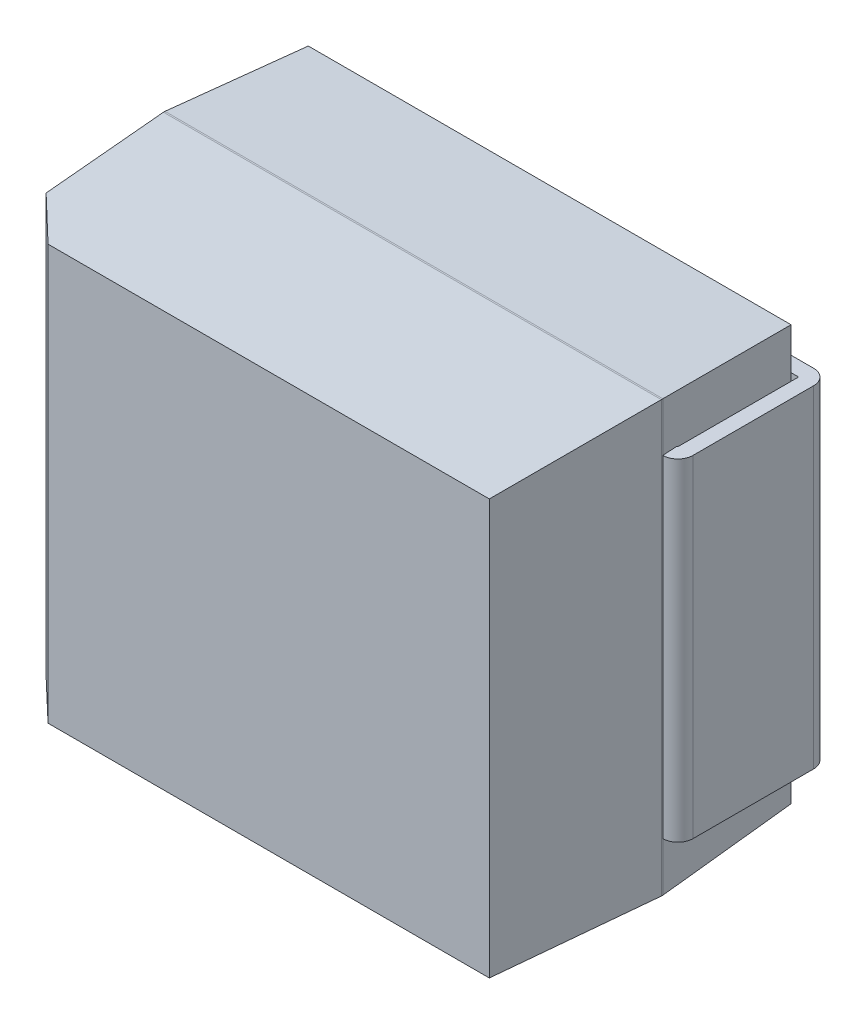
ISO-10303-21;
HEADER;
FILE_DESCRIPTION(('STEP AP214'),'2;1');
FILE_NAME('part.step','',(''),(''),'','','');
FILE_SCHEMA(('AUTOMOTIVE_DESIGN { 1 0 10303 214 1 1 1 1 }'));
ENDSEC;
DATA;
#1=APPLICATION_CONTEXT('core data for automotive mechanical design processes');
#2=APPLICATION_PROTOCOL_DEFINITION('international standard','automotive_design',2000,#1);
#3=PRODUCT_CONTEXT('',#1,'mechanical');
#4=PRODUCT('Part','Part','',(#3));
#5=PRODUCT_RELATED_PRODUCT_CATEGORY('part','',(#4));
#6=PRODUCT_DEFINITION_FORMATION('','',#4);
#7=PRODUCT_DEFINITION_CONTEXT('part definition',#1,'design');
#8=PRODUCT_DEFINITION('design','',#6,#7);
#9=PRODUCT_DEFINITION_SHAPE('','',#8);
#10=(LENGTH_UNIT() NAMED_UNIT(*) SI_UNIT(.MILLI.,.METRE.));
#11=(NAMED_UNIT(*) PLANE_ANGLE_UNIT() SI_UNIT($,.RADIAN.));
#12=(NAMED_UNIT(*) SI_UNIT($,.STERADIAN.) SOLID_ANGLE_UNIT());
#13=UNCERTAINTY_MEASURE_WITH_UNIT(LENGTH_MEASURE(1.E-05),#10,'distance_accuracy_value','');
#14=(GEOMETRIC_REPRESENTATION_CONTEXT(3) GLOBAL_UNCERTAINTY_ASSIGNED_CONTEXT((#13)) GLOBAL_UNIT_ASSIGNED_CONTEXT((#10,
#11,#12)) REPRESENTATION_CONTEXT('',''));
#15=CARTESIAN_POINT('',(0.,0.,0.));
#16=DIRECTION('',(0.,0.,1.));
#17=DIRECTION('',(1.,0.,0.));
#18=AXIS2_PLACEMENT_3D('',#15,#16,#17);
#19=CARTESIAN_POINT('',(-1.625,-1.425,1.555));
#20=DIRECTION('',(0.998949557473894,0.,-0.0458233741960452));
#21=DIRECTION('',(0.,1.,0.));
#22=AXIS2_PLACEMENT_3D('',#19,#20,#21);
#23=PLANE('',#22);
#24=DIRECTION('',(0.,1.,0.));
#25=VECTOR('',#24,1.);
#26=CARTESIAN_POINT('',(-1.612601427904,-1.375,1.825288871695));
#27=LINE('',#26,#25);
#28=CARTESIAN_POINT('',(-1.612601427904,-1.387601427904,1.825288871695));
#29=VERTEX_POINT('',#28);
#30=CARTESIAN_POINT('',(-1.612601427904,1.387601427904,1.825288871695));
#31=VERTEX_POINT('',#30);
#32=EDGE_CURVE('P0_E11',#29,#31,#27,.T.);
#33=ORIENTED_EDGE('',*,*,#32,.T.);
#34=DIRECTION('',(0.0457753402888472,-0.0457753402888473,0.99790241829694));
#35=VECTOR('',#34,1.);
#36=CARTESIAN_POINT('',(-1.62206646551,1.39706646551,1.618951051882));
#37=LINE('',#36,#35);
#38=CARTESIAN_POINT('',(-1.65,1.425,1.01));
#39=VERTEX_POINT('',#38);
#40=EDGE_CURVE('P0_E24',#39,#31,#37,.T.);
#41=ORIENTED_EDGE('',*,*,#40,.F.);
#42=DIRECTION('',(0.,1.,0.));
#43=VECTOR('',#42,1.);
#44=CARTESIAN_POINT('',(-1.65,-1.425,1.01));
#45=LINE('',#44,#43);
#46=CARTESIAN_POINT('',(-1.65,-1.425,1.01));
#47=VERTEX_POINT('',#46);
#48=EDGE_CURVE('P0_E171',#47,#39,#45,.T.);
#49=ORIENTED_EDGE('',*,*,#48,.F.);
#50=DIRECTION('',(0.0457753402888473,0.0457753402888472,0.99790241829694));
#51=VECTOR('',#50,1.);
#52=CARTESIAN_POINT('',(-1.625052384544,-1.400052384544,1.553858016931));
#53=LINE('',#52,#51);
#54=EDGE_CURVE('P0_E36',#47,#29,#53,.T.);
#55=ORIENTED_EDGE('',*,*,#54,.T.);
#56=EDGE_LOOP('',(#33,#41,#49,#55));
#57=FACE_BOUND('',#56,.T.);
#58=ADVANCED_FACE('P0_F17',(#57),#23,.F.);
#59=CARTESIAN_POINT('',(-1.65,-1.4,1.555));
#60=DIRECTION('',(0.,0.998949557473894,-0.0458233741960452));
#61=DIRECTION('',(-1.,0.,0.));
#62=AXIS2_PLACEMENT_3D('',#59,#60,#61);
#63=PLANE('',#62);
#64=ORIENTED_EDGE('',*,*,#54,.F.);
#65=DIRECTION('',(1.,0.,0.));
#66=VECTOR('',#65,1.);
#67=CARTESIAN_POINT('',(-1.65,-1.425,1.01));
#68=LINE('',#67,#66);
#69=CARTESIAN_POINT('',(1.65,-1.425,1.01));
#70=VERTEX_POINT('',#69);
#71=EDGE_CURVE('P0_E168',#47,#70,#68,.T.);
#72=ORIENTED_EDGE('',*,*,#71,.T.);
#73=DIRECTION('',(-0.0457753402888472,0.0457753402888473,0.99790241829694));
#74=VECTOR('',#73,1.);
#75=CARTESIAN_POINT('',(1.62159500461,-1.39659500461,1.629228899505));
#76=LINE('',#75,#74);
#77=CARTESIAN_POINT('',(1.6,-1.375,2.1));
#78=VERTEX_POINT('',#77);
#79=EDGE_CURVE('P0_E166',#70,#78,#76,.T.);
#80=ORIENTED_EDGE('',*,*,#79,.T.);
#81=DIRECTION('',(1.,0.,0.));
#82=VECTOR('',#81,1.);
#83=CARTESIAN_POINT('',(-1.65,-1.375,2.1));
#84=LINE('',#83,#82);
#85=CARTESIAN_POINT('',(-1.325,-1.375,2.1));
#86=VERTEX_POINT('',#85);
#87=EDGE_CURVE('P0_E163',#86,#78,#84,.T.);
#88=ORIENTED_EDGE('',*,*,#87,.F.);
#89=DIRECTION('',(0.722763632283053,0.0316683191393221,0.69036935723705));
#90=VECTOR('',#89,1.);
#91=CARTESIAN_POINT('',(-1.617972667321,-1.387836771959,1.820158371295));
#92=LINE('',#91,#90);
#93=EDGE_CURVE('P0_E160',#29,#86,#92,.T.);
#94=ORIENTED_EDGE('',*,*,#93,.F.);
#95=EDGE_LOOP('',(#64,#72,#80,#88,#94));
#96=FACE_BOUND('',#95,.T.);
#97=ADVANCED_FACE('P0_F207',(#96),#63,.F.);
#98=CARTESIAN_POINT('',(-1.468800713952,-1.375,1.962644435847));
#99=DIRECTION('',(0.690715797489705,0.,-0.723126328588692));
#100=DIRECTION('',(0.,1.,0.));
#101=AXIS2_PLACEMENT_3D('',#98,#99,#100);
#102=PLANE('',#101);
#103=DIRECTION('',(0.,1.,0.));
#104=VECTOR('',#103,1.);
#105=CARTESIAN_POINT('',(-1.325,-1.375,2.1));
#106=LINE('',#105,#104);
#107=CARTESIAN_POINT('',(-1.325,1.375,2.1));
#108=VERTEX_POINT('',#107);
#109=EDGE_CURVE('P0_E157',#86,#108,#106,.T.);
#110=ORIENTED_EDGE('',*,*,#109,.T.);
#111=DIRECTION('',(0.722763632283053,-0.0316683191393225,0.69036935723705));
#112=VECTOR('',#111,1.);
#113=CARTESIAN_POINT('',(-1.586500691939,1.386457808608,1.850219772347));
#114=LINE('',#113,#112);
#115=EDGE_CURVE('P0_E155',#31,#108,#114,.T.);
#116=ORIENTED_EDGE('',*,*,#115,.F.);
#117=ORIENTED_EDGE('',*,*,#32,.F.);
#118=ORIENTED_EDGE('',*,*,#93,.T.);
#119=EDGE_LOOP('',(#110,#116,#117,#118));
#120=FACE_BOUND('',#119,.T.);
#121=ADVANCED_FACE('P0_F211',(#120),#102,.F.);
#122=CARTESIAN_POINT('',(-1.65,-1.425,0.1));
#123=DIRECTION('',(1.,0.,0.));
#124=DIRECTION('',(0.,0.,1.));
#125=AXIS2_PLACEMENT_3D('',#122,#123,#124);
#126=PLANE('',#125);
#127=ORIENTED_EDGE('',*,*,#48,.T.);
#128=DIRECTION('',(0.,0.,1.));
#129=VECTOR('',#128,1.);
#130=CARTESIAN_POINT('',(-1.65,1.425,0.1));
#131=LINE('',#130,#129);
#132=CARTESIAN_POINT('',(-1.65,1.425,1.));
#133=VERTEX_POINT('',#132);
#134=EDGE_CURVE('P0_E152',#133,#39,#131,.T.);
#135=ORIENTED_EDGE('',*,*,#134,.F.);
#136=DIRECTION('',(0.,1.,0.));
#137=VECTOR('',#136,1.);
#138=CARTESIAN_POINT('',(-1.65,-1.425,1.));
#139=LINE('',#138,#137);
#140=CARTESIAN_POINT('',(-1.65,-1.425,1.));
#141=VERTEX_POINT('',#140);
#142=EDGE_CURVE('P0_E150',#141,#133,#139,.T.);
#143=ORIENTED_EDGE('',*,*,#142,.F.);
#144=DIRECTION('',(0.,0.,1.));
#145=VECTOR('',#144,1.);
#146=CARTESIAN_POINT('',(-1.65,-1.425,0.1));
#147=LINE('',#146,#145);
#148=EDGE_CURVE('P0_E147',#141,#47,#147,.T.);
#149=ORIENTED_EDGE('',*,*,#148,.T.);
#150=EDGE_LOOP('',(#127,#135,#143,#149));
#151=FACE_BOUND('',#150,.T.);
#152=ADVANCED_FACE('P0_F174',(#151),#126,.F.);
#153=CARTESIAN_POINT('',(-1.65,1.4,1.555));
#154=DIRECTION('',(0.,0.998949557473894,0.0458233741960452));
#155=DIRECTION('',(-1.,0.,0.));
#156=AXIS2_PLACEMENT_3D('',#153,#154,#155);
#157=PLANE('',#156);
#158=ORIENTED_EDGE('',*,*,#115,.T.);
#159=DIRECTION('',(1.,0.,0.));
#160=VECTOR('',#159,1.);
#161=CARTESIAN_POINT('',(-1.65,1.375,2.1));
#162=LINE('',#161,#160);
#163=CARTESIAN_POINT('',(1.6,1.375,2.1));
#164=VERTEX_POINT('',#163);
#165=EDGE_CURVE('P0_E144',#108,#164,#162,.T.);
#166=ORIENTED_EDGE('',*,*,#165,.T.);
#167=DIRECTION('',(-0.0457753402888473,-0.0457753402888472,0.99790241829694));
#168=VECTOR('',#167,1.);
#169=CARTESIAN_POINT('',(1.618609085575,1.393609085575,1.694321934456));
#170=LINE('',#169,#168);
#171=CARTESIAN_POINT('',(1.65,1.425,1.01));
#172=VERTEX_POINT('',#171);
#173=EDGE_CURVE('P0_E142',#172,#164,#170,.T.);
#174=ORIENTED_EDGE('',*,*,#173,.F.);
#175=DIRECTION('',(1.,0.,0.));
#176=VECTOR('',#175,1.);
#177=CARTESIAN_POINT('',(-1.65,1.425,1.01));
#178=LINE('',#177,#176);
#179=EDGE_CURVE('P0_E140',#39,#172,#178,.T.);
#180=ORIENTED_EDGE('',*,*,#179,.F.);
#181=ORIENTED_EDGE('',*,*,#40,.T.);
#182=EDGE_LOOP('',(#158,#166,#174,#180,#181));
#183=FACE_BOUND('',#182,.T.);
#184=ADVANCED_FACE('P0_F181',(#183),#157,.T.);
#185=CARTESIAN_POINT('',(-1.65,-1.425,0.1));
#186=DIRECTION('',(0.,1.,0.));
#187=DIRECTION('',(0.,0.,1.));
#188=AXIS2_PLACEMENT_3D('',#185,#186,#187);
#189=PLANE('',#188);
#190=ORIENTED_EDGE('',*,*,#71,.F.);
#191=ORIENTED_EDGE('',*,*,#148,.F.);
#192=DIRECTION('',(1.,0.,0.));
#193=VECTOR('',#192,1.);
#194=CARTESIAN_POINT('',(-1.65,-1.425,1.));
#195=LINE('',#194,#193);
#196=CARTESIAN_POINT('',(1.65,-1.425,1.));
#197=VERTEX_POINT('',#196);
#198=EDGE_CURVE('P0_E137',#141,#197,#195,.T.);
#199=ORIENTED_EDGE('',*,*,#198,.T.);
#200=DIRECTION('',(0.,0.,1.));
#201=VECTOR('',#200,1.);
#202=CARTESIAN_POINT('',(1.65,-1.425,0.1));
#203=LINE('',#202,#201);
#204=EDGE_CURVE('P0_E134',#197,#70,#203,.T.);
#205=ORIENTED_EDGE('',*,*,#204,.T.);
#206=EDGE_LOOP('',(#190,#191,#199,#205));
#207=FACE_BOUND('',#206,.T.);
#208=ADVANCED_FACE('P0_F223',(#207),#189,.F.);
#209=CARTESIAN_POINT('',(-1.65,-1.425,2.1));
#210=DIRECTION('',(0.,0.,1.));
#211=DIRECTION('',(1.,0.,0.));
#212=AXIS2_PLACEMENT_3D('',#209,#210,#211);
#213=PLANE('',#212);
#214=ORIENTED_EDGE('',*,*,#87,.T.);
#215=DIRECTION('',(0.,1.,0.));
#216=VECTOR('',#215,1.);
#217=CARTESIAN_POINT('',(1.6,-1.425,2.1));
#218=LINE('',#217,#216);
#219=EDGE_CURVE('P0_E131',#78,#164,#218,.T.);
#220=ORIENTED_EDGE('',*,*,#219,.T.);
#221=ORIENTED_EDGE('',*,*,#165,.F.);
#222=ORIENTED_EDGE('',*,*,#109,.F.);
#223=EDGE_LOOP('',(#214,#220,#221,#222));
#224=FACE_BOUND('',#223,.T.);
#225=ADVANCED_FACE('P0_F204',(#224),#213,.T.);
#226=CARTESIAN_POINT('',(1.625,-1.425,1.555));
#227=DIRECTION('',(0.998949557473894,0.,0.0458233741960452));
#228=DIRECTION('',(0.,1.,0.));
#229=AXIS2_PLACEMENT_3D('',#226,#227,#228);
#230=PLANE('',#229);
#231=ORIENTED_EDGE('',*,*,#79,.F.);
#232=DIRECTION('',(0.,1.,0.));
#233=VECTOR('',#232,1.);
#234=CARTESIAN_POINT('',(1.65,-1.425,1.01));
#235=LINE('',#234,#233);
#236=EDGE_CURVE('P0_E128',#70,#172,#235,.T.);
#237=ORIENTED_EDGE('',*,*,#236,.T.);
#238=ORIENTED_EDGE('',*,*,#173,.T.);
#239=ORIENTED_EDGE('',*,*,#219,.F.);
#240=EDGE_LOOP('',(#231,#237,#238,#239));
#241=FACE_BOUND('',#240,.T.);
#242=ADVANCED_FACE('P0_F187',(#241),#230,.T.);
#243=CARTESIAN_POINT('',(-1.625,-1.425,0.55));
#244=DIRECTION('',(-0.998460353205411,0.,-0.0554700196225429));
#245=DIRECTION('',(0.,1.,0.));
#246=AXIS2_PLACEMENT_3D('',#243,#244,#245);
#247=PLANE('',#246);
#248=DIRECTION('',(0.0553848775621745,0.0553848775621744,-0.99692779611908));
#249=VECTOR('',#248,1.);
#250=CARTESIAN_POINT('',(-1.625076687117,-1.400076687117,0.551380368098));
#251=LINE('',#250,#249);
#252=CARTESIAN_POINT('',(-1.6,-1.375,0.1));
#253=VERTEX_POINT('',#252);
#254=EDGE_CURVE('P0_E126',#141,#253,#251,.T.);
#255=ORIENTED_EDGE('',*,*,#254,.F.);
#256=ORIENTED_EDGE('',*,*,#142,.T.);
#257=DIRECTION('',(0.0553848775621744,-0.0553848775621745,-0.99692779611908));
#258=VECTOR('',#257,1.);
#259=CARTESIAN_POINT('',(-1.620705521472,1.395705521472,0.472699386503));
#260=LINE('',#259,#258);
#261=CARTESIAN_POINT('',(-1.6,1.375,0.1));
#262=VERTEX_POINT('',#261);
#263=EDGE_CURVE('P0_E124',#133,#262,#260,.T.);
#264=ORIENTED_EDGE('',*,*,#263,.T.);
#265=DIRECTION('',(0.,1.,0.));
#266=VECTOR('',#265,1.);
#267=CARTESIAN_POINT('',(-1.6,-1.425,0.1));
#268=LINE('',#267,#266);
#269=EDGE_CURVE('P0_E103',#253,#262,#268,.T.);
#270=ORIENTED_EDGE('',*,*,#269,.F.);
#271=EDGE_LOOP('',(#255,#256,#264,#270));
#272=FACE_BOUND('',#271,.T.);
#273=ADVANCED_FACE('P0_F195',(#272),#247,.T.);
#274=CARTESIAN_POINT('',(-1.65,1.425,0.1));
#275=DIRECTION('',(0.,1.,0.));
#276=DIRECTION('',(0.,0.,1.));
#277=AXIS2_PLACEMENT_3D('',#274,#275,#276);
#278=PLANE('',#277);
#279=DIRECTION('',(0.,0.,1.));
#280=VECTOR('',#279,1.);
#281=CARTESIAN_POINT('',(1.65,1.425,0.1));
#282=LINE('',#281,#280);
#283=CARTESIAN_POINT('',(1.65,1.425,1.));
#284=VERTEX_POINT('',#283);
#285=EDGE_CURVE('P0_E120',#284,#172,#282,.T.);
#286=ORIENTED_EDGE('',*,*,#285,.F.);
#287=DIRECTION('',(1.,0.,0.));
#288=VECTOR('',#287,1.);
#289=CARTESIAN_POINT('',(-1.65,1.425,1.));
#290=LINE('',#289,#288);
#291=EDGE_CURVE('P0_E110',#133,#284,#290,.T.);
#292=ORIENTED_EDGE('',*,*,#291,.F.);
#293=ORIENTED_EDGE('',*,*,#134,.T.);
#294=ORIENTED_EDGE('',*,*,#179,.T.);
#295=EDGE_LOOP('',(#286,#292,#293,#294));
#296=FACE_BOUND('',#295,.T.);
#297=ADVANCED_FACE('P0_F179',(#296),#278,.T.);
#298=CARTESIAN_POINT('',(1.65,-1.425,0.1));
#299=DIRECTION('',(1.,0.,0.));
#300=DIRECTION('',(0.,0.,1.));
#301=AXIS2_PLACEMENT_3D('',#298,#299,#300);
#302=PLANE('',#301);
#303=ORIENTED_EDGE('',*,*,#204,.F.);
#304=DIRECTION('',(0.,1.,0.));
#305=VECTOR('',#304,1.);
#306=CARTESIAN_POINT('',(1.65,-1.425,1.));
#307=LINE('',#306,#305);
#308=EDGE_CURVE('P0_E117',#197,#284,#307,.T.);
#309=ORIENTED_EDGE('',*,*,#308,.T.);
#310=ORIENTED_EDGE('',*,*,#285,.T.);
#311=ORIENTED_EDGE('',*,*,#236,.F.);
#312=EDGE_LOOP('',(#303,#309,#310,#311));
#313=FACE_BOUND('',#312,.T.);
#314=ADVANCED_FACE('P0_F189',(#313),#302,.T.);
#315=CARTESIAN_POINT('',(-1.65,-1.4,0.55));
#316=DIRECTION('',(0.,-0.998460353205411,-0.0554700196225429));
#317=DIRECTION('',(-1.,0.,0.));
#318=AXIS2_PLACEMENT_3D('',#315,#316,#317);
#319=PLANE('',#318);
#320=DIRECTION('',(1.,0.,0.));
#321=VECTOR('',#320,1.);
#322=CARTESIAN_POINT('',(-1.65,-1.375,0.1));
#323=LINE('',#322,#321);
#324=CARTESIAN_POINT('',(1.6,-1.375,0.1));
#325=VERTEX_POINT('',#324);
#326=EDGE_CURVE('P0_E115',#253,#325,#323,.T.);
#327=ORIENTED_EDGE('',*,*,#326,.T.);
#328=DIRECTION('',(-0.0553848775621744,0.0553848775621745,-0.99692779611908));
#329=VECTOR('',#328,1.);
#330=CARTESIAN_POINT('',(1.620015337423,-1.395015337423,0.46027607362));
#331=LINE('',#330,#329);
#332=EDGE_CURVE('P0_E93',#197,#325,#331,.T.);
#333=ORIENTED_EDGE('',*,*,#332,.F.);
#334=ORIENTED_EDGE('',*,*,#198,.F.);
#335=ORIENTED_EDGE('',*,*,#254,.T.);
#336=EDGE_LOOP('',(#327,#333,#334,#335));
#337=FACE_BOUND('',#336,.T.);
#338=ADVANCED_FACE('P0_F192',(#337),#319,.T.);
#339=CARTESIAN_POINT('',(-1.65,-1.425,0.1));
#340=DIRECTION('',(0.,0.,1.));
#341=DIRECTION('',(1.,0.,0.));
#342=AXIS2_PLACEMENT_3D('',#339,#340,#341);
#343=PLANE('',#342);
#344=DIRECTION('',(1.,0.,0.));
#345=VECTOR('',#344,1.);
#346=CARTESIAN_POINT('',(-1.65,1.375,0.1));
#347=LINE('',#346,#345);
#348=CARTESIAN_POINT('',(1.6,1.375,0.1));
#349=VERTEX_POINT('',#348);
#350=EDGE_CURVE('P0_E97',#262,#349,#347,.T.);
#351=ORIENTED_EDGE('',*,*,#350,.T.);
#352=DIRECTION('',(0.,1.,0.));
#353=VECTOR('',#352,1.);
#354=CARTESIAN_POINT('',(1.6,-1.425,0.1));
#355=LINE('',#354,#353);
#356=EDGE_CURVE('P0_E86',#325,#349,#355,.T.);
#357=ORIENTED_EDGE('',*,*,#356,.F.);
#358=ORIENTED_EDGE('',*,*,#326,.F.);
#359=ORIENTED_EDGE('',*,*,#269,.T.);
#360=EDGE_LOOP('',(#351,#357,#358,#359));
#361=FACE_BOUND('',#360,.T.);
#362=ADVANCED_FACE('P0_F101',(#361),#343,.F.);
#363=CARTESIAN_POINT('',(-1.65,1.4,0.55));
#364=DIRECTION('',(0.,-0.998460353205411,0.0554700196225429));
#365=DIRECTION('',(-1.,0.,0.));
#366=AXIS2_PLACEMENT_3D('',#363,#364,#365);
#367=PLANE('',#366);
#368=ORIENTED_EDGE('',*,*,#263,.F.);
#369=ORIENTED_EDGE('',*,*,#291,.T.);
#370=DIRECTION('',(-0.0553848775621745,-0.0553848775621744,-0.99692779611908));
#371=VECTOR('',#370,1.);
#372=CARTESIAN_POINT('',(1.615644171779,1.390644171779,0.381595092025));
#373=LINE('',#372,#371);
#374=EDGE_CURVE('P0_E91',#284,#349,#373,.T.);
#375=ORIENTED_EDGE('',*,*,#374,.T.);
#376=ORIENTED_EDGE('',*,*,#350,.F.);
#377=EDGE_LOOP('',(#368,#369,#375,#376));
#378=FACE_BOUND('',#377,.T.);
#379=ADVANCED_FACE('P0_F108',(#378),#367,.F.);
#380=CARTESIAN_POINT('',(1.625,-1.425,0.55));
#381=DIRECTION('',(-0.998460353205411,0.,0.0554700196225429));
#382=DIRECTION('',(0.,1.,0.));
#383=AXIS2_PLACEMENT_3D('',#380,#381,#382);
#384=PLANE('',#383);
#385=ORIENTED_EDGE('',*,*,#356,.T.);
#386=ORIENTED_EDGE('',*,*,#374,.F.);
#387=ORIENTED_EDGE('',*,*,#308,.F.);
#388=ORIENTED_EDGE('',*,*,#332,.T.);
#389=EDGE_LOOP('',(#385,#386,#387,#388));
#390=FACE_BOUND('',#389,.T.);
#391=ADVANCED_FACE('P0_F88',(#390),#384,.F.);
#392=CLOSED_SHELL('',(#58,#97,#121,#152,#184,#208,#225,#242,#273,#297,#314,#338,#362,#379,#391));
#393=MANIFOLD_SOLID_BREP('P0_B1',#392);
#394=CARTESIAN_POINT('',(-1.447,-1.1,0.482));
#395=DIRECTION('',(0.,-1.,0.));
#396=DIRECTION('',(-1.,0.,0.));
#397=AXIS2_PLACEMENT_3D('',#394,#395,#396);
#398=PLANE('',#397);
#399=DIRECTION('',(1.,0.,0.));
#400=VECTOR('',#399,1.);
#401=CARTESIAN_POINT('',(-1.75,-1.1,1.));
#402=LINE('',#401,#400);
#403=CARTESIAN_POINT('',(-1.65,-1.1,1.));
#404=VERTEX_POINT('',#403);
#405=CARTESIAN_POINT('',(-1.,-1.1,1.));
#406=VERTEX_POINT('',#405);
#407=EDGE_CURVE('P1_E11',#404,#406,#402,.T.);
#408=ORIENTED_EDGE('',*,*,#407,.F.);
#409=CARTESIAN_POINT('',(-1.65,-1.1,0.9));
#410=DIRECTION('',(0.,-1.,0.));
#411=DIRECTION('',(0.,0.,1.));
#412=AXIS2_PLACEMENT_3D('',#409,#410,#411);
#413=CIRCLE('',#412,0.1);
#414=CARTESIAN_POINT('',(-1.75,-1.1,0.9));
#415=VERTEX_POINT('',#414);
#416=EDGE_CURVE('P1_E24',#404,#415,#413,.T.);
#417=ORIENTED_EDGE('',*,*,#416,.T.);
#418=DIRECTION('',(0.,0.,1.));
#419=VECTOR('',#418,1.);
#420=CARTESIAN_POINT('',(-1.75,-1.1,0.));
#421=LINE('',#420,#419);
#422=CARTESIAN_POINT('',(-1.75,-1.1,0.1));
#423=VERTEX_POINT('',#422);
#424=EDGE_CURVE('P1_E168',#423,#415,#421,.T.);
#425=ORIENTED_EDGE('',*,*,#424,.F.);
#426=CARTESIAN_POINT('',(-1.65,-1.1,0.1));
#427=DIRECTION('',(0.,-1.,0.));
#428=DIRECTION('',(0.,0.,1.));
#429=AXIS2_PLACEMENT_3D('',#426,#427,#428);
#430=CIRCLE('',#429,0.1);
#431=CARTESIAN_POINT('',(-1.65,-1.1,0.));
#432=VERTEX_POINT('',#431);
#433=EDGE_CURVE('P1_E166',#423,#432,#430,.T.);
#434=ORIENTED_EDGE('',*,*,#433,.T.);
#435=DIRECTION('',(1.,0.,0.));
#436=VECTOR('',#435,1.);
#437=CARTESIAN_POINT('',(-1.75,-1.1,0.));
#438=LINE('',#437,#436);
#439=CARTESIAN_POINT('',(-0.9,-1.1,0.));
#440=VERTEX_POINT('',#439);
#441=EDGE_CURVE('P1_E164',#432,#440,#438,.T.);
#442=ORIENTED_EDGE('',*,*,#441,.T.);
#443=DIRECTION('',(0.,0.,1.));
#444=VECTOR('',#443,1.);
#445=CARTESIAN_POINT('',(-0.9,-1.1,0.));
#446=LINE('',#445,#444);
#447=CARTESIAN_POINT('',(-0.9,-1.1,0.1));
#448=VERTEX_POINT('',#447);
#449=EDGE_CURVE('P1_E162',#440,#448,#446,.T.);
#450=ORIENTED_EDGE('',*,*,#449,.T.);
#451=DIRECTION('',(1.,0.,0.));
#452=VECTOR('',#451,1.);
#453=CARTESIAN_POINT('',(-1.75,-1.1,0.1));
#454=LINE('',#453,#452);
#455=CARTESIAN_POINT('',(-1.65,-1.1,0.1));
#456=VERTEX_POINT('',#455);
#457=EDGE_CURVE('P1_E107',#456,#448,#454,.T.);
#458=ORIENTED_EDGE('',*,*,#457,.F.);
#459=DIRECTION('',(0.,0.,1.));
#460=VECTOR('',#459,1.);
#461=CARTESIAN_POINT('',(-1.65,-1.1,0.));
#462=LINE('',#461,#460);
#463=CARTESIAN_POINT('',(-1.65,-1.1,0.9));
#464=VERTEX_POINT('',#463);
#465=EDGE_CURVE('P1_E159',#456,#464,#462,.T.);
#466=ORIENTED_EDGE('',*,*,#465,.T.);
#467=DIRECTION('',(1.,0.,0.));
#468=VECTOR('',#467,1.);
#469=CARTESIAN_POINT('',(-1.75,-1.1,0.9));
#470=LINE('',#469,#468);
#471=CARTESIAN_POINT('',(-1.,-1.1,0.9));
#472=VERTEX_POINT('',#471);
#473=EDGE_CURVE('P1_E157',#464,#472,#470,.T.);
#474=ORIENTED_EDGE('',*,*,#473,.T.);
#475=DIRECTION('',(0.,0.,1.));
#476=VECTOR('',#475,1.);
#477=CARTESIAN_POINT('',(-1.,-1.1,0.9));
#478=LINE('',#477,#476);
#479=EDGE_CURVE('P1_E155',#472,#406,#478,.T.);
#480=ORIENTED_EDGE('',*,*,#479,.T.);
#481=EDGE_LOOP('',(#408,#417,#425,#434,#442,#450,#458,#466,#474,#480));
#482=FACE_BOUND('',#481,.T.);
#483=ADVANCED_FACE('P1_F17',(#482),#398,.T.);
#484=CARTESIAN_POINT('',(-1.75,-1.1,1.));
#485=DIRECTION('',(0.,0.,1.));
#486=DIRECTION('',(1.,0.,0.));
#487=AXIS2_PLACEMENT_3D('',#484,#485,#486);
#488=PLANE('',#487);
#489=DIRECTION('',(1.,0.,0.));
#490=VECTOR('',#489,1.);
#491=CARTESIAN_POINT('',(-1.75,1.1,1.));
#492=LINE('',#491,#490);
#493=CARTESIAN_POINT('',(-1.65,1.1,1.));
#494=VERTEX_POINT('',#493);
#495=CARTESIAN_POINT('',(-1.,1.1,1.));
#496=VERTEX_POINT('',#495);
#497=EDGE_CURVE('P1_E153',#494,#496,#492,.T.);
#498=ORIENTED_EDGE('',*,*,#497,.F.);
#499=DIRECTION('',(0.,1.,0.));
#500=VECTOR('',#499,1.);
#501=CARTESIAN_POINT('',(-1.65,-1.1,1.));
#502=LINE('',#501,#500);
#503=EDGE_CURVE('P1_E150',#404,#494,#502,.T.);
#504=ORIENTED_EDGE('',*,*,#503,.F.);
#505=ORIENTED_EDGE('',*,*,#407,.T.);
#506=DIRECTION('',(0.,1.,0.));
#507=VECTOR('',#506,1.);
#508=CARTESIAN_POINT('',(-1.,-1.1,1.));
#509=LINE('',#508,#507);
#510=EDGE_CURVE('P1_E148',#406,#496,#509,.T.);
#511=ORIENTED_EDGE('',*,*,#510,.T.);
#512=EDGE_LOOP('',(#498,#504,#505,#511));
#513=FACE_BOUND('',#512,.T.);
#514=ADVANCED_FACE('P1_F199',(#513),#488,.T.);
#515=CARTESIAN_POINT('',(-1.65,-1.1,0.9));
#516=DIRECTION('',(0.,1.,0.));
#517=DIRECTION('',(0.,0.,1.));
#518=AXIS2_PLACEMENT_3D('',#515,#516,#517);
#519=CYLINDRICAL_SURFACE('',#518,0.1);
#520=ORIENTED_EDGE('',*,*,#503,.T.);
#521=CARTESIAN_POINT('',(-1.65,1.1,0.9));
#522=DIRECTION('',(0.,-1.,0.));
#523=DIRECTION('',(0.,0.,1.));
#524=AXIS2_PLACEMENT_3D('',#521,#522,#523);
#525=CIRCLE('',#524,0.1);
#526=CARTESIAN_POINT('',(-1.75,1.1,0.9));
#527=VERTEX_POINT('',#526);
#528=EDGE_CURVE('P1_E146',#494,#527,#525,.T.);
#529=ORIENTED_EDGE('',*,*,#528,.T.);
#530=DIRECTION('',(0.,1.,0.));
#531=VECTOR('',#530,1.);
#532=CARTESIAN_POINT('',(-1.75,-1.1,0.9));
#533=LINE('',#532,#531);
#534=EDGE_CURVE('P1_E143',#415,#527,#533,.T.);
#535=ORIENTED_EDGE('',*,*,#534,.F.);
#536=ORIENTED_EDGE('',*,*,#416,.F.);
#537=EDGE_LOOP('',(#520,#529,#535,#536));
#538=FACE_BOUND('',#537,.T.);
#539=ADVANCED_FACE('P1_F177',(#538),#519,.T.);
#540=CARTESIAN_POINT('',(-1.,-1.1,0.9));
#541=DIRECTION('',(1.,0.,0.));
#542=DIRECTION('',(0.,0.,1.));
#543=AXIS2_PLACEMENT_3D('',#540,#541,#542);
#544=PLANE('',#543);
#545=ORIENTED_EDGE('',*,*,#479,.F.);
#546=DIRECTION('',(0.,1.,0.));
#547=VECTOR('',#546,1.);
#548=CARTESIAN_POINT('',(-1.,-1.1,0.9));
#549=LINE('',#548,#547);
#550=CARTESIAN_POINT('',(-1.,1.1,0.9));
#551=VERTEX_POINT('',#550);
#552=EDGE_CURVE('P1_E141',#472,#551,#549,.T.);
#553=ORIENTED_EDGE('',*,*,#552,.T.);
#554=DIRECTION('',(0.,0.,1.));
#555=VECTOR('',#554,1.);
#556=CARTESIAN_POINT('',(-1.,1.1,0.9));
#557=LINE('',#556,#555);
#558=EDGE_CURVE('P1_E138',#551,#496,#557,.T.);
#559=ORIENTED_EDGE('',*,*,#558,.T.);
#560=ORIENTED_EDGE('',*,*,#510,.F.);
#561=EDGE_LOOP('',(#545,#553,#559,#560));
#562=FACE_BOUND('',#561,.T.);
#563=ADVANCED_FACE('P1_F198',(#562),#544,.T.);
#564=CARTESIAN_POINT('',(-1.75,-1.1,0.));
#565=DIRECTION('',(1.,0.,0.));
#566=DIRECTION('',(0.,0.,1.));
#567=AXIS2_PLACEMENT_3D('',#564,#565,#566);
#568=PLANE('',#567);
#569=ORIENTED_EDGE('',*,*,#534,.T.);
#570=DIRECTION('',(0.,0.,1.));
#571=VECTOR('',#570,1.);
#572=CARTESIAN_POINT('',(-1.75,1.1,0.));
#573=LINE('',#572,#571);
#574=CARTESIAN_POINT('',(-1.75,1.1,0.1));
#575=VERTEX_POINT('',#574);
#576=EDGE_CURVE('P1_E135',#575,#527,#573,.T.);
#577=ORIENTED_EDGE('',*,*,#576,.F.);
#578=DIRECTION('',(0.,1.,0.));
#579=VECTOR('',#578,1.);
#580=CARTESIAN_POINT('',(-1.75,-1.1,0.1));
#581=LINE('',#580,#579);
#582=EDGE_CURVE('P1_E133',#423,#575,#581,.T.);
#583=ORIENTED_EDGE('',*,*,#582,.F.);
#584=ORIENTED_EDGE('',*,*,#424,.T.);
#585=EDGE_LOOP('',(#569,#577,#583,#584));
#586=FACE_BOUND('',#585,.T.);
#587=ADVANCED_FACE('P1_F175',(#586),#568,.F.);
#588=CARTESIAN_POINT('',(-1.75,-1.1,0.9));
#589=DIRECTION('',(0.,0.,1.));
#590=DIRECTION('',(1.,0.,0.));
#591=AXIS2_PLACEMENT_3D('',#588,#589,#590);
#592=PLANE('',#591);
#593=ORIENTED_EDGE('',*,*,#552,.F.);
#594=ORIENTED_EDGE('',*,*,#473,.F.);
#595=DIRECTION('',(0.,1.,0.));
#596=VECTOR('',#595,1.);
#597=CARTESIAN_POINT('',(-1.65,-1.1,0.9));
#598=LINE('',#597,#596);
#599=CARTESIAN_POINT('',(-1.65,1.1,0.9));
#600=VERTEX_POINT('',#599);
#601=EDGE_CURVE('P1_E130',#464,#600,#598,.T.);
#602=ORIENTED_EDGE('',*,*,#601,.T.);
#603=DIRECTION('',(1.,0.,0.));
#604=VECTOR('',#603,1.);
#605=CARTESIAN_POINT('',(-1.75,1.1,0.9));
#606=LINE('',#605,#604);
#607=EDGE_CURVE('P1_E127',#600,#551,#606,.T.);
#608=ORIENTED_EDGE('',*,*,#607,.T.);
#609=EDGE_LOOP('',(#593,#594,#602,#608));
#610=FACE_BOUND('',#609,.T.);
#611=ADVANCED_FACE('P1_F194',(#610),#592,.F.);
#612=CARTESIAN_POINT('',(-1.65,-1.1,0.1));
#613=DIRECTION('',(0.,1.,0.));
#614=DIRECTION('',(-1.,0.,0.));
#615=AXIS2_PLACEMENT_3D('',#612,#613,#614);
#616=CYLINDRICAL_SURFACE('',#615,0.1);
#617=ORIENTED_EDGE('',*,*,#582,.T.);
#618=CARTESIAN_POINT('',(-1.65,1.1,0.1));
#619=DIRECTION('',(0.,-1.,0.));
#620=DIRECTION('',(0.,0.,1.));
#621=AXIS2_PLACEMENT_3D('',#618,#619,#620);
#622=CIRCLE('',#621,0.1);
#623=CARTESIAN_POINT('',(-1.65,1.1,0.));
#624=VERTEX_POINT('',#623);
#625=EDGE_CURVE('P1_E125',#575,#624,#622,.T.);
#626=ORIENTED_EDGE('',*,*,#625,.T.);
#627=DIRECTION('',(0.,1.,0.));
#628=VECTOR('',#627,1.);
#629=CARTESIAN_POINT('',(-1.65,-1.1,0.));
#630=LINE('',#629,#628);
#631=EDGE_CURVE('P1_E122',#432,#624,#630,.T.);
#632=ORIENTED_EDGE('',*,*,#631,.F.);
#633=ORIENTED_EDGE('',*,*,#433,.F.);
#634=EDGE_LOOP('',(#617,#626,#632,#633));
#635=FACE_BOUND('',#634,.T.);
#636=ADVANCED_FACE('P1_F183',(#635),#616,.T.);
#637=CARTESIAN_POINT('',(-1.65,-1.1,0.));
#638=DIRECTION('',(1.,0.,0.));
#639=DIRECTION('',(0.,0.,1.));
#640=AXIS2_PLACEMENT_3D('',#637,#638,#639);
#641=PLANE('',#640);
#642=ORIENTED_EDGE('',*,*,#465,.F.);
#643=DIRECTION('',(0.,-1.,0.));
#644=VECTOR('',#643,1.);
#645=CARTESIAN_POINT('',(-1.65,-1.1,0.1));
#646=LINE('',#645,#644);
#647=CARTESIAN_POINT('',(-1.65,1.1,0.1));
#648=VERTEX_POINT('',#647);
#649=EDGE_CURVE('P1_E120',#648,#456,#646,.T.);
#650=ORIENTED_EDGE('',*,*,#649,.F.);
#651=DIRECTION('',(0.,0.,1.));
#652=VECTOR('',#651,1.);
#653=CARTESIAN_POINT('',(-1.65,1.1,0.));
#654=LINE('',#653,#652);
#655=EDGE_CURVE('P1_E98',#648,#600,#654,.T.);
#656=ORIENTED_EDGE('',*,*,#655,.T.);
#657=ORIENTED_EDGE('',*,*,#601,.F.);
#658=EDGE_LOOP('',(#642,#650,#656,#657));
#659=FACE_BOUND('',#658,.T.);
#660=ADVANCED_FACE('P1_F191',(#659),#641,.T.);
#661=CARTESIAN_POINT('',(-1.75,-1.1,0.));
#662=DIRECTION('',(0.,0.,1.));
#663=DIRECTION('',(1.,0.,0.));
#664=AXIS2_PLACEMENT_3D('',#661,#662,#663);
#665=PLANE('',#664);
#666=DIRECTION('',(0.,1.,0.));
#667=VECTOR('',#666,1.);
#668=CARTESIAN_POINT('',(-0.9,-1.1,0.));
#669=LINE('',#668,#667);
#670=CARTESIAN_POINT('',(-0.9,1.1,0.));
#671=VERTEX_POINT('',#670);
#672=EDGE_CURVE('P1_E114',#440,#671,#669,.T.);
#673=ORIENTED_EDGE('',*,*,#672,.F.);
#674=ORIENTED_EDGE('',*,*,#441,.F.);
#675=ORIENTED_EDGE('',*,*,#631,.T.);
#676=DIRECTION('',(1.,0.,0.));
#677=VECTOR('',#676,1.);
#678=CARTESIAN_POINT('',(-1.75,1.1,0.));
#679=LINE('',#678,#677);
#680=EDGE_CURVE('P1_E101',#624,#671,#679,.T.);
#681=ORIENTED_EDGE('',*,*,#680,.T.);
#682=EDGE_LOOP('',(#673,#674,#675,#681));
#683=FACE_BOUND('',#682,.T.);
#684=ADVANCED_FACE('P1_F186',(#683),#665,.F.);
#685=CARTESIAN_POINT('',(-1.75,-1.1,0.1));
#686=DIRECTION('',(0.,0.,1.));
#687=DIRECTION('',(1.,0.,0.));
#688=AXIS2_PLACEMENT_3D('',#685,#686,#687);
#689=PLANE('',#688);
#690=DIRECTION('',(1.,0.,0.));
#691=VECTOR('',#690,1.);
#692=CARTESIAN_POINT('',(-1.75,1.1,0.1));
#693=LINE('',#692,#691);
#694=CARTESIAN_POINT('',(-0.9,1.1,0.1));
#695=VERTEX_POINT('',#694);
#696=EDGE_CURVE('P1_E91',#648,#695,#693,.T.);
#697=ORIENTED_EDGE('',*,*,#696,.F.);
#698=ORIENTED_EDGE('',*,*,#649,.T.);
#699=ORIENTED_EDGE('',*,*,#457,.T.);
#700=DIRECTION('',(0.,1.,0.));
#701=VECTOR('',#700,1.);
#702=CARTESIAN_POINT('',(-0.9,-1.1,0.1));
#703=LINE('',#702,#701);
#704=EDGE_CURVE('P1_E102',#448,#695,#703,.T.);
#705=ORIENTED_EDGE('',*,*,#704,.T.);
#706=EDGE_LOOP('',(#697,#698,#699,#705));
#707=FACE_BOUND('',#706,.T.);
#708=ADVANCED_FACE('P1_F106',(#707),#689,.T.);
#709=CARTESIAN_POINT('',(-0.9,-1.1,0.));
#710=DIRECTION('',(1.,0.,0.));
#711=DIRECTION('',(0.,0.,1.));
#712=AXIS2_PLACEMENT_3D('',#709,#710,#711);
#713=PLANE('',#712);
#714=ORIENTED_EDGE('',*,*,#449,.F.);
#715=ORIENTED_EDGE('',*,*,#672,.T.);
#716=DIRECTION('',(0.,0.,1.));
#717=VECTOR('',#716,1.);
#718=CARTESIAN_POINT('',(-0.9,1.1,0.));
#719=LINE('',#718,#717);
#720=EDGE_CURVE('P1_E96',#671,#695,#719,.T.);
#721=ORIENTED_EDGE('',*,*,#720,.T.);
#722=ORIENTED_EDGE('',*,*,#704,.F.);
#723=EDGE_LOOP('',(#714,#715,#721,#722));
#724=FACE_BOUND('',#723,.T.);
#725=ADVANCED_FACE('P1_F112',(#724),#713,.T.);
#726=CARTESIAN_POINT('',(-1.447,1.1,0.482));
#727=DIRECTION('',(0.,1.,0.));
#728=DIRECTION('',(1.,0.,0.));
#729=AXIS2_PLACEMENT_3D('',#726,#727,#728);
#730=PLANE('',#729);
#731=ORIENTED_EDGE('',*,*,#680,.F.);
#732=ORIENTED_EDGE('',*,*,#625,.F.);
#733=ORIENTED_EDGE('',*,*,#576,.T.);
#734=ORIENTED_EDGE('',*,*,#528,.F.);
#735=ORIENTED_EDGE('',*,*,#497,.T.);
#736=ORIENTED_EDGE('',*,*,#558,.F.);
#737=ORIENTED_EDGE('',*,*,#607,.F.);
#738=ORIENTED_EDGE('',*,*,#655,.F.);
#739=ORIENTED_EDGE('',*,*,#696,.T.);
#740=ORIENTED_EDGE('',*,*,#720,.F.);
#741=EDGE_LOOP('',(#731,#732,#733,#734,#735,#736,#737,#738,#739,#740));
#742=FACE_BOUND('',#741,.T.);
#743=ADVANCED_FACE('P1_F94',(#742),#730,.T.);
#744=CLOSED_SHELL('',(#483,#514,#539,#563,#587,#611,#636,#660,#684,#708,#725,#743));
#745=MANIFOLD_SOLID_BREP('P1_B1',#744);
#746=CARTESIAN_POINT('',(1.402777777778,-1.1,0.483333333333));
#747=DIRECTION('',(0.,-1.,0.));
#748=DIRECTION('',(0.,0.,-1.));
#749=AXIS2_PLACEMENT_3D('',#746,#747,#748);
#750=PLANE('',#749);
#751=DIRECTION('',(1.,0.,0.));
#752=VECTOR('',#751,1.);
#753=CARTESIAN_POINT('',(0.8,-1.1,0.));
#754=LINE('',#753,#752);
#755=CARTESIAN_POINT('',(0.8,-1.1,0.));
#756=VERTEX_POINT('',#755);
#757=CARTESIAN_POINT('',(1.65,-1.1,0.));
#758=VERTEX_POINT('',#757);
#759=EDGE_CURVE('P2_E10',#756,#758,#754,.T.);
#760=ORIENTED_EDGE('',*,*,#759,.T.);
#761=CARTESIAN_POINT('',(1.65,-1.1,0.1));
#762=DIRECTION('',(0.,1.,0.));
#763=DIRECTION('',(0.,0.,1.));
#764=AXIS2_PLACEMENT_3D('',#761,#762,#763);
#765=CIRCLE('',#764,0.1);
#766=CARTESIAN_POINT('',(1.75,-1.1,0.1));
#767=VERTEX_POINT('',#766);
#768=EDGE_CURVE('P2_E23',#767,#758,#765,.T.);
#769=ORIENTED_EDGE('',*,*,#768,.F.);
#770=DIRECTION('',(0.,0.,1.));
#771=VECTOR('',#770,1.);
#772=CARTESIAN_POINT('',(1.75,-1.1,0.));
#773=LINE('',#772,#771);
#774=CARTESIAN_POINT('',(1.75,-1.1,0.9));
#775=VERTEX_POINT('',#774);
#776=EDGE_CURVE('P2_E171',#767,#775,#773,.T.);
#777=ORIENTED_EDGE('',*,*,#776,.T.);
#778=CARTESIAN_POINT('',(1.65,-1.1,0.9));
#779=DIRECTION('',(0.,-1.,0.));
#780=DIRECTION('',(0.,0.,1.));
#781=AXIS2_PLACEMENT_3D('',#778,#779,#780);
#782=CIRCLE('',#781,0.1);
#783=CARTESIAN_POINT('',(1.65,-1.1,1.));
#784=VERTEX_POINT('',#783);
#785=EDGE_CURVE('P2_E169',#775,#784,#782,.T.);
#786=ORIENTED_EDGE('',*,*,#785,.T.);
#787=DIRECTION('',(1.,0.,0.));
#788=VECTOR('',#787,1.);
#789=CARTESIAN_POINT('',(1.65,-1.1,1.));
#790=LINE('',#789,#788);
#791=CARTESIAN_POINT('',(0.9,-1.1,1.));
#792=VERTEX_POINT('',#791);
#793=EDGE_CURVE('P2_E166',#792,#784,#790,.T.);
#794=ORIENTED_EDGE('',*,*,#793,.F.);
#795=DIRECTION('',(0.,0.,1.));
#796=VECTOR('',#795,1.);
#797=CARTESIAN_POINT('',(0.9,-1.1,0.9));
#798=LINE('',#797,#796);
#799=CARTESIAN_POINT('',(0.9,-1.1,0.9));
#800=VERTEX_POINT('',#799);
#801=EDGE_CURVE('P2_E164',#800,#792,#798,.T.);
#802=ORIENTED_EDGE('',*,*,#801,.F.);
#803=DIRECTION('',(1.,0.,0.));
#804=VECTOR('',#803,1.);
#805=CARTESIAN_POINT('',(0.9,-1.1,0.9));
#806=LINE('',#805,#804);
#807=CARTESIAN_POINT('',(1.65,-1.1,0.9));
#808=VERTEX_POINT('',#807);
#809=EDGE_CURVE('P2_E95',#800,#808,#806,.T.);
#810=ORIENTED_EDGE('',*,*,#809,.T.);
#811=DIRECTION('',(0.,0.,1.));
#812=VECTOR('',#811,1.);
#813=CARTESIAN_POINT('',(1.65,-1.1,0.));
#814=LINE('',#813,#812);
#815=CARTESIAN_POINT('',(1.65,-1.1,0.1));
#816=VERTEX_POINT('',#815);
#817=EDGE_CURVE('P2_E160',#816,#808,#814,.T.);
#818=ORIENTED_EDGE('',*,*,#817,.F.);
#819=DIRECTION('',(1.,0.,0.));
#820=VECTOR('',#819,1.);
#821=CARTESIAN_POINT('',(0.8,-1.1,0.1));
#822=LINE('',#821,#820);
#823=CARTESIAN_POINT('',(0.8,-1.1,0.1));
#824=VERTEX_POINT('',#823);
#825=EDGE_CURVE('P2_E157',#824,#816,#822,.T.);
#826=ORIENTED_EDGE('',*,*,#825,.F.);
#827=DIRECTION('',(0.,0.,1.));
#828=VECTOR('',#827,1.);
#829=CARTESIAN_POINT('',(0.8,-1.1,0.));
#830=LINE('',#829,#828);
#831=EDGE_CURVE('P2_E154',#756,#824,#830,.T.);
#832=ORIENTED_EDGE('',*,*,#831,.F.);
#833=EDGE_LOOP('',(#760,#769,#777,#786,#794,#802,#810,#818,#826,#832));
#834=FACE_BOUND('',#833,.T.);
#835=ADVANCED_FACE('P2_F16',(#834),#750,.T.);
#836=CARTESIAN_POINT('',(1.275,0.,0.));
#837=DIRECTION('',(0.,0.,-1.));
#838=DIRECTION('',(-1.,0.,0.));
#839=AXIS2_PLACEMENT_3D('',#836,#837,#838);
#840=PLANE('',#839);
#841=ORIENTED_EDGE('',*,*,#759,.F.);
#842=DIRECTION('',(0.,1.,0.));
#843=VECTOR('',#842,1.);
#844=CARTESIAN_POINT('',(0.8,-1.1,0.));
#845=LINE('',#844,#843);
#846=CARTESIAN_POINT('',(0.8,1.1,0.));
#847=VERTEX_POINT('',#846);
#848=EDGE_CURVE('P2_E152',#756,#847,#845,.T.);
#849=ORIENTED_EDGE('',*,*,#848,.T.);
#850=DIRECTION('',(1.,0.,0.));
#851=VECTOR('',#850,1.);
#852=CARTESIAN_POINT('',(1.65,1.1,0.));
#853=LINE('',#852,#851);
#854=CARTESIAN_POINT('',(1.65,1.1,0.));
#855=VERTEX_POINT('',#854);
#856=EDGE_CURVE('P2_E150',#847,#855,#853,.T.);
#857=ORIENTED_EDGE('',*,*,#856,.T.);
#858=DIRECTION('',(0.,1.,0.));
#859=VECTOR('',#858,1.);
#860=CARTESIAN_POINT('',(1.65,-1.1,0.));
#861=LINE('',#860,#859);
#862=EDGE_CURVE('P2_E147',#758,#855,#861,.T.);
#863=ORIENTED_EDGE('',*,*,#862,.F.);
#864=EDGE_LOOP('',(#841,#849,#857,#863));
#865=FACE_BOUND('',#864,.T.);
#866=ADVANCED_FACE('P2_F177',(#865),#840,.T.);
#867=CARTESIAN_POINT('',(1.65,-1.1,0.1));
#868=DIRECTION('',(0.,1.,0.));
#869=DIRECTION('',(1.,0.,0.));
#870=AXIS2_PLACEMENT_3D('',#867,#868,#869);
#871=CYLINDRICAL_SURFACE('',#870,0.1);
#872=ORIENTED_EDGE('',*,*,#768,.T.);
#873=ORIENTED_EDGE('',*,*,#862,.T.);
#874=CARTESIAN_POINT('',(1.65,1.1,0.1));
#875=DIRECTION('',(0.,1.,0.));
#876=DIRECTION('',(0.,0.,1.));
#877=AXIS2_PLACEMENT_3D('',#874,#875,#876);
#878=CIRCLE('',#877,0.1);
#879=CARTESIAN_POINT('',(1.75,1.1,0.1));
#880=VERTEX_POINT('',#879);
#881=EDGE_CURVE('P2_E144',#880,#855,#878,.T.);
#882=ORIENTED_EDGE('',*,*,#881,.F.);
#883=DIRECTION('',(0.,1.,0.));
#884=VECTOR('',#883,1.);
#885=CARTESIAN_POINT('',(1.75,-1.1,0.1));
#886=LINE('',#885,#884);
#887=EDGE_CURVE('P2_E141',#767,#880,#886,.T.);
#888=ORIENTED_EDGE('',*,*,#887,.F.);
#889=EDGE_LOOP('',(#872,#873,#882,#888));
#890=FACE_BOUND('',#889,.T.);
#891=ADVANCED_FACE('P2_F174',(#890),#871,.T.);
#892=CARTESIAN_POINT('',(0.8,-1.1,0.));
#893=DIRECTION('',(1.,0.,0.));
#894=DIRECTION('',(0.,0.,1.));
#895=AXIS2_PLACEMENT_3D('',#892,#893,#894);
#896=PLANE('',#895);
#897=DIRECTION('',(0.,1.,0.));
#898=VECTOR('',#897,1.);
#899=CARTESIAN_POINT('',(0.8,-1.1,0.1));
#900=LINE('',#899,#898);
#901=CARTESIAN_POINT('',(0.8,1.1,0.1));
#902=VERTEX_POINT('',#901);
#903=EDGE_CURVE('P2_E138',#824,#902,#900,.T.);
#904=ORIENTED_EDGE('',*,*,#903,.T.);
#905=DIRECTION('',(0.,0.,1.));
#906=VECTOR('',#905,1.);
#907=CARTESIAN_POINT('',(0.8,1.1,0.));
#908=LINE('',#907,#906);
#909=EDGE_CURVE('P2_E136',#847,#902,#908,.T.);
#910=ORIENTED_EDGE('',*,*,#909,.F.);
#911=ORIENTED_EDGE('',*,*,#848,.F.);
#912=ORIENTED_EDGE('',*,*,#831,.T.);
#913=EDGE_LOOP('',(#904,#910,#911,#912));
#914=FACE_BOUND('',#913,.T.);
#915=ADVANCED_FACE('P2_F210',(#914),#896,.F.);
#916=CARTESIAN_POINT('',(1.75,-1.1,0.));
#917=DIRECTION('',(1.,0.,0.));
#918=DIRECTION('',(0.,0.,1.));
#919=AXIS2_PLACEMENT_3D('',#916,#917,#918);
#920=PLANE('',#919);
#921=ORIENTED_EDGE('',*,*,#776,.F.);
#922=ORIENTED_EDGE('',*,*,#887,.T.);
#923=DIRECTION('',(0.,0.,1.));
#924=VECTOR('',#923,1.);
#925=CARTESIAN_POINT('',(1.75,1.1,0.));
#926=LINE('',#925,#924);
#927=CARTESIAN_POINT('',(1.75,1.1,0.9));
#928=VERTEX_POINT('',#927);
#929=EDGE_CURVE('P2_E134',#880,#928,#926,.T.);
#930=ORIENTED_EDGE('',*,*,#929,.T.);
#931=DIRECTION('',(0.,1.,0.));
#932=VECTOR('',#931,1.);
#933=CARTESIAN_POINT('',(1.75,-1.1,0.9));
#934=LINE('',#933,#932);
#935=EDGE_CURVE('P2_E131',#775,#928,#934,.T.);
#936=ORIENTED_EDGE('',*,*,#935,.F.);
#937=EDGE_LOOP('',(#921,#922,#930,#936));
#938=FACE_BOUND('',#937,.T.);
#939=ADVANCED_FACE('P2_F182',(#938),#920,.T.);
#940=CARTESIAN_POINT('',(0.8,-1.1,0.1));
#941=DIRECTION('',(0.,0.,1.));
#942=DIRECTION('',(1.,0.,0.));
#943=AXIS2_PLACEMENT_3D('',#940,#941,#942);
#944=PLANE('',#943);
#945=ORIENTED_EDGE('',*,*,#903,.F.);
#946=ORIENTED_EDGE('',*,*,#825,.T.);
#947=DIRECTION('',(0.,1.,0.));
#948=VECTOR('',#947,1.);
#949=CARTESIAN_POINT('',(1.65,-1.1,0.1));
#950=LINE('',#949,#948);
#951=CARTESIAN_POINT('',(1.65,1.1,0.1));
#952=VERTEX_POINT('',#951);
#953=EDGE_CURVE('P2_E129',#816,#952,#950,.T.);
#954=ORIENTED_EDGE('',*,*,#953,.T.);
#955=DIRECTION('',(1.,0.,0.));
#956=VECTOR('',#955,1.);
#957=CARTESIAN_POINT('',(0.8,1.1,0.1));
#958=LINE('',#957,#956);
#959=EDGE_CURVE('P2_E127',#902,#952,#958,.T.);
#960=ORIENTED_EDGE('',*,*,#959,.F.);
#961=EDGE_LOOP('',(#945,#946,#954,#960));
#962=FACE_BOUND('',#961,.T.);
#963=ADVANCED_FACE('P2_F192',(#962),#944,.T.);
#964=CARTESIAN_POINT('',(1.65,-1.1,0.9));
#965=DIRECTION('',(0.,1.,0.));
#966=DIRECTION('',(1.,0.,0.));
#967=AXIS2_PLACEMENT_3D('',#964,#965,#966);
#968=CYLINDRICAL_SURFACE('',#967,0.1);
#969=ORIENTED_EDGE('',*,*,#935,.T.);
#970=CARTESIAN_POINT('',(1.65,1.1,0.9));
#971=DIRECTION('',(0.,-1.,0.));
#972=DIRECTION('',(0.,0.,1.));
#973=AXIS2_PLACEMENT_3D('',#970,#971,#972);
#974=CIRCLE('',#973,0.1);
#975=CARTESIAN_POINT('',(1.65,1.1,1.));
#976=VERTEX_POINT('',#975);
#977=EDGE_CURVE('P2_E125',#928,#976,#974,.T.);
#978=ORIENTED_EDGE('',*,*,#977,.T.);
#979=DIRECTION('',(0.,1.,0.));
#980=VECTOR('',#979,1.);
#981=CARTESIAN_POINT('',(1.65,-1.1,1.));
#982=LINE('',#981,#980);
#983=EDGE_CURVE('P2_E122',#784,#976,#982,.T.);
#984=ORIENTED_EDGE('',*,*,#983,.F.);
#985=ORIENTED_EDGE('',*,*,#785,.F.);
#986=EDGE_LOOP('',(#969,#978,#984,#985));
#987=FACE_BOUND('',#986,.T.);
#988=ADVANCED_FACE('P2_F189',(#987),#968,.T.);
#989=CARTESIAN_POINT('',(1.65,-1.1,0.));
#990=DIRECTION('',(1.,0.,0.));
#991=DIRECTION('',(0.,0.,1.));
#992=AXIS2_PLACEMENT_3D('',#989,#990,#991);
#993=PLANE('',#992);
#994=DIRECTION('',(0.,1.,0.));
#995=VECTOR('',#994,1.);
#996=CARTESIAN_POINT('',(1.65,-1.1,0.9));
#997=LINE('',#996,#995);
#998=CARTESIAN_POINT('',(1.65,1.1,0.9));
#999=VERTEX_POINT('',#998);
#1000=EDGE_CURVE('P2_E120',#808,#999,#997,.T.);
#1001=ORIENTED_EDGE('',*,*,#1000,.T.);
#1002=DIRECTION('',(0.,0.,1.));
#1003=VECTOR('',#1002,1.);
#1004=CARTESIAN_POINT('',(1.65,1.1,0.));
#1005=LINE('',#1004,#1003);
#1006=EDGE_CURVE('P2_E107',#952,#999,#1005,.T.);
#1007=ORIENTED_EDGE('',*,*,#1006,.F.);
#1008=ORIENTED_EDGE('',*,*,#953,.F.);
#1009=ORIENTED_EDGE('',*,*,#817,.T.);
#1010=EDGE_LOOP('',(#1001,#1007,#1008,#1009));
#1011=FACE_BOUND('',#1010,.T.);
#1012=ADVANCED_FACE('P2_F191',(#1011),#993,.F.);
#1013=CARTESIAN_POINT('',(1.325,0.,1.));
#1014=DIRECTION('',(0.,0.,1.));
#1015=DIRECTION('',(1.,0.,0.));
#1016=AXIS2_PLACEMENT_3D('',#1013,#1014,#1015);
#1017=PLANE('',#1016);
#1018=ORIENTED_EDGE('',*,*,#793,.T.);
#1019=ORIENTED_EDGE('',*,*,#983,.T.);
#1020=DIRECTION('',(1.,0.,0.));
#1021=VECTOR('',#1020,1.);
#1022=CARTESIAN_POINT('',(1.65,1.1,1.));
#1023=LINE('',#1022,#1021);
#1024=CARTESIAN_POINT('',(0.9,1.1,1.));
#1025=VERTEX_POINT('',#1024);
#1026=EDGE_CURVE('P2_E117',#1025,#976,#1023,.T.);
#1027=ORIENTED_EDGE('',*,*,#1026,.F.);
#1028=DIRECTION('',(0.,1.,0.));
#1029=VECTOR('',#1028,1.);
#1030=CARTESIAN_POINT('',(0.9,-1.1,1.));
#1031=LINE('',#1030,#1029);
#1032=EDGE_CURVE('P2_E109',#792,#1025,#1031,.T.);
#1033=ORIENTED_EDGE('',*,*,#1032,.F.);
#1034=EDGE_LOOP('',(#1018,#1019,#1027,#1033));
#1035=FACE_BOUND('',#1034,.T.);
#1036=ADVANCED_FACE('P2_F188',(#1035),#1017,.T.);
#1037=CARTESIAN_POINT('',(0.9,-1.1,0.9));
#1038=DIRECTION('',(0.,0.,1.));
#1039=DIRECTION('',(1.,0.,0.));
#1040=AXIS2_PLACEMENT_3D('',#1037,#1038,#1039);
#1041=PLANE('',#1040);
#1042=DIRECTION('',(1.,0.,0.));
#1043=VECTOR('',#1042,1.);
#1044=CARTESIAN_POINT('',(0.9,1.1,0.9));
#1045=LINE('',#1044,#1043);
#1046=CARTESIAN_POINT('',(0.9,1.1,0.9));
#1047=VERTEX_POINT('',#1046);
#1048=EDGE_CURVE('P2_E94',#1047,#999,#1045,.T.);
#1049=ORIENTED_EDGE('',*,*,#1048,.T.);
#1050=ORIENTED_EDGE('',*,*,#1000,.F.);
#1051=ORIENTED_EDGE('',*,*,#809,.F.);
#1052=DIRECTION('',(0.,1.,0.));
#1053=VECTOR('',#1052,1.);
#1054=CARTESIAN_POINT('',(0.9,-1.1,0.9));
#1055=LINE('',#1054,#1053);
#1056=EDGE_CURVE('P2_E90',#800,#1047,#1055,.T.);
#1057=ORIENTED_EDGE('',*,*,#1056,.T.);
#1058=EDGE_LOOP('',(#1049,#1050,#1051,#1057));
#1059=FACE_BOUND('',#1058,.T.);
#1060=ADVANCED_FACE('P2_F92',(#1059),#1041,.F.);
#1061=CARTESIAN_POINT('',(0.9,-1.1,0.9));
#1062=DIRECTION('',(1.,0.,0.));
#1063=DIRECTION('',(0.,0.,1.));
#1064=AXIS2_PLACEMENT_3D('',#1061,#1062,#1063);
#1065=PLANE('',#1064);
#1066=ORIENTED_EDGE('',*,*,#1032,.T.);
#1067=DIRECTION('',(0.,0.,1.));
#1068=VECTOR('',#1067,1.);
#1069=CARTESIAN_POINT('',(0.9,1.1,0.9));
#1070=LINE('',#1069,#1068);
#1071=EDGE_CURVE('P2_E99',#1047,#1025,#1070,.T.);
#1072=ORIENTED_EDGE('',*,*,#1071,.F.);
#1073=ORIENTED_EDGE('',*,*,#1056,.F.);
#1074=ORIENTED_EDGE('',*,*,#801,.T.);
#1075=EDGE_LOOP('',(#1066,#1072,#1073,#1074));
#1076=FACE_BOUND('',#1075,.T.);
#1077=ADVANCED_FACE('P2_F112',(#1076),#1065,.F.);
#1078=CARTESIAN_POINT('',(1.402777777778,1.1,0.483333333333));
#1079=DIRECTION('',(0.,1.,0.));
#1080=DIRECTION('',(1.,0.,0.));
#1081=AXIS2_PLACEMENT_3D('',#1078,#1079,#1080);
#1082=PLANE('',#1081);
#1083=ORIENTED_EDGE('',*,*,#1026,.T.);
#1084=ORIENTED_EDGE('',*,*,#977,.F.);
#1085=ORIENTED_EDGE('',*,*,#929,.F.);
#1086=ORIENTED_EDGE('',*,*,#881,.T.);
#1087=ORIENTED_EDGE('',*,*,#856,.F.);
#1088=ORIENTED_EDGE('',*,*,#909,.T.);
#1089=ORIENTED_EDGE('',*,*,#959,.T.);
#1090=ORIENTED_EDGE('',*,*,#1006,.T.);
#1091=ORIENTED_EDGE('',*,*,#1048,.F.);
#1092=ORIENTED_EDGE('',*,*,#1071,.T.);
#1093=EDGE_LOOP('',(#1083,#1084,#1085,#1086,#1087,#1088,#1089,#1090,#1091,#1092));
#1094=FACE_BOUND('',#1093,.T.);
#1095=ADVANCED_FACE('P2_F104',(#1094),#1082,.T.);
#1096=CLOSED_SHELL('',(#835,#866,#891,#915,#939,#963,#988,#1012,#1036,#1060,#1077,#1095));
#1097=MANIFOLD_SOLID_BREP('P2_B1',#1096);
#1098=ADVANCED_BREP_SHAPE_REPRESENTATION('',(#18,#393,#745,#1097),#14);
#1099=SHAPE_DEFINITION_REPRESENTATION(#9,#1098);
ENDSEC;
END-ISO-10303-21;
